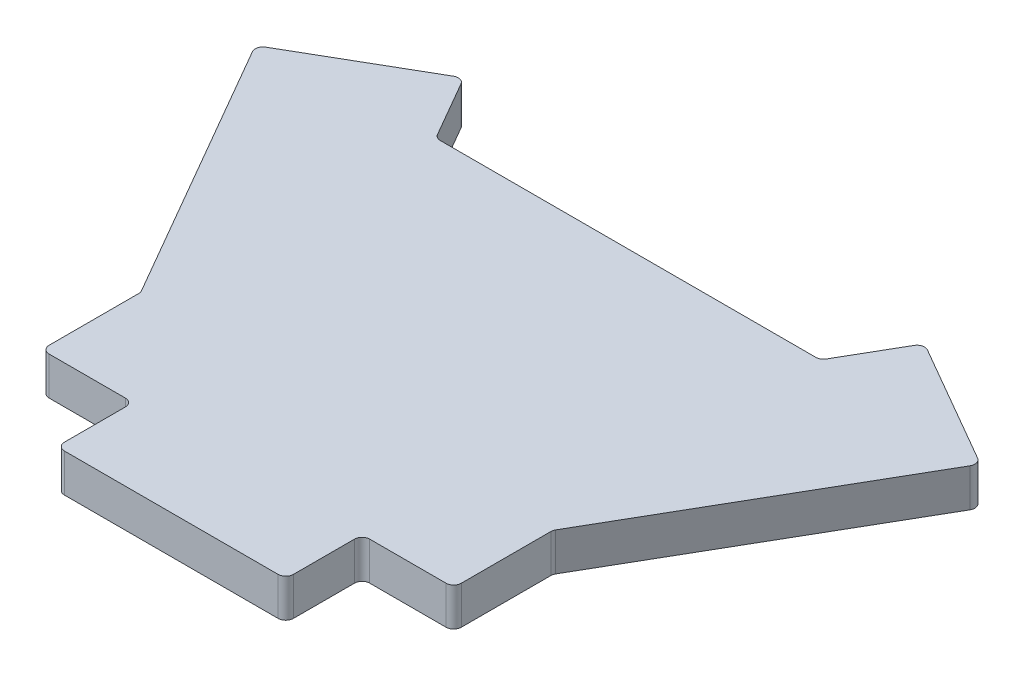
ISO-10303-21;
HEADER;
FILE_DESCRIPTION(('STEP AP214'),'2;1');
FILE_NAME('part.step','',(''),(''),'','','');
FILE_SCHEMA(('AUTOMOTIVE_DESIGN { 1 0 10303 214 1 1 1 1 }'));
ENDSEC;
DATA;
#1=APPLICATION_CONTEXT('core data for automotive mechanical design processes');
#2=APPLICATION_PROTOCOL_DEFINITION('international standard','automotive_design',2000,#1);
#3=PRODUCT_CONTEXT('',#1,'mechanical');
#4=PRODUCT('Part','Part','',(#3));
#5=PRODUCT_RELATED_PRODUCT_CATEGORY('part','',(#4));
#6=PRODUCT_DEFINITION_FORMATION('','',#4);
#7=PRODUCT_DEFINITION_CONTEXT('part definition',#1,'design');
#8=PRODUCT_DEFINITION('design','',#6,#7);
#9=PRODUCT_DEFINITION_SHAPE('','',#8);
#10=(LENGTH_UNIT() NAMED_UNIT(*) SI_UNIT(.MILLI.,.METRE.));
#11=(NAMED_UNIT(*) PLANE_ANGLE_UNIT() SI_UNIT($,.RADIAN.));
#12=(NAMED_UNIT(*) SI_UNIT($,.STERADIAN.) SOLID_ANGLE_UNIT());
#13=UNCERTAINTY_MEASURE_WITH_UNIT(LENGTH_MEASURE(1.E-05),#10,'distance_accuracy_value','');
#14=(GEOMETRIC_REPRESENTATION_CONTEXT(3) GLOBAL_UNCERTAINTY_ASSIGNED_CONTEXT((#13)) GLOBAL_UNIT_ASSIGNED_CONTEXT((#10,
#11,#12)) REPRESENTATION_CONTEXT('',''));
#15=CARTESIAN_POINT('',(0.,0.,0.));
#16=DIRECTION('',(0.,0.,1.));
#17=DIRECTION('',(1.,0.,0.));
#18=AXIS2_PLACEMENT_3D('',#15,#16,#17);
#19=CARTESIAN_POINT('',(-15.,5.,-10.));
#20=DIRECTION('',(0.,0.,-1.));
#21=DIRECTION('',(-1.,0.,0.));
#22=AXIS2_PLACEMENT_3D('',#19,#20,#21);
#23=PLANE('',#22);
#24=DIRECTION('',(1.,0.,0.));
#25=VECTOR('',#24,1.);
#26=CARTESIAN_POINT('',(-15.,5.,-10.));
#27=LINE('',#26,#25);
#28=CARTESIAN_POINT('',(-26.,5.,-9.99999999999999));
#29=VERTEX_POINT('',#28);
#30=CARTESIAN_POINT('',(-16.,5.,-10.));
#31=VERTEX_POINT('',#30);
#32=EDGE_CURVE('E272',#29,#31,#27,.T.);
#33=ORIENTED_EDGE('',*,*,#32,.F.);
#34=DIRECTION('',(0.,-1.,0.));
#35=VECTOR('',#34,1.);
#36=CARTESIAN_POINT('',(-26.,5.,-9.99999999999999));
#37=LINE('',#36,#35);
#38=CARTESIAN_POINT('',(-26.,0.,-9.99999999999999));
#39=VERTEX_POINT('',#38);
#40=EDGE_CURVE('E347',#29,#39,#37,.T.);
#41=ORIENTED_EDGE('',*,*,#40,.T.);
#42=DIRECTION('',(1.,0.,0.));
#43=VECTOR('',#42,1.);
#44=CARTESIAN_POINT('',(-15.,0.,-10.));
#45=LINE('',#44,#43);
#46=CARTESIAN_POINT('',(-16.,0.,-10.));
#47=VERTEX_POINT('',#46);
#48=EDGE_CURVE('E437',#39,#47,#45,.T.);
#49=ORIENTED_EDGE('',*,*,#48,.T.);
#50=DIRECTION('',(0.,-1.,0.));
#51=VECTOR('',#50,1.);
#52=CARTESIAN_POINT('',(-16.,5.,-10.));
#53=LINE('',#52,#51);
#54=EDGE_CURVE('E345',#47,#31,#53,.F.);
#55=ORIENTED_EDGE('',*,*,#54,.T.);
#56=EDGE_LOOP('',(#33,#41,#49,#55));
#57=FACE_BOUND('',#56,.T.);
#58=ADVANCED_FACE('F37',(#57),#23,.F.);
#59=CARTESIAN_POINT('',(-15.,5.,0.));
#60=DIRECTION('',(1.,0.,0.));
#61=DIRECTION('',(0.,0.,-1.));
#62=AXIS2_PLACEMENT_3D('',#59,#60,#61);
#63=PLANE('',#62);
#64=DIRECTION('',(0.,0.,1.));
#65=VECTOR('',#64,1.);
#66=CARTESIAN_POINT('',(-15.,0.,0.));
#67=LINE('',#66,#65);
#68=CARTESIAN_POINT('',(-15.,0.,-9.));
#69=VERTEX_POINT('',#68);
#70=CARTESIAN_POINT('',(-15.,0.,-1.));
#71=VERTEX_POINT('',#70);
#72=EDGE_CURVE('E440',#69,#71,#67,.T.);
#73=ORIENTED_EDGE('',*,*,#72,.T.);
#74=DIRECTION('',(0.,-1.,0.));
#75=VECTOR('',#74,1.);
#76=CARTESIAN_POINT('',(-15.,5.,-1.));
#77=LINE('',#76,#75);
#78=CARTESIAN_POINT('',(-15.,5.,-1.));
#79=VERTEX_POINT('',#78);
#80=EDGE_CURVE('E343',#71,#79,#77,.F.);
#81=ORIENTED_EDGE('',*,*,#80,.T.);
#82=DIRECTION('',(0.,0.,1.));
#83=VECTOR('',#82,1.);
#84=CARTESIAN_POINT('',(-15.,5.,0.));
#85=LINE('',#84,#83);
#86=CARTESIAN_POINT('',(-15.,5.,-9.));
#87=VERTEX_POINT('',#86);
#88=EDGE_CURVE('E539',#87,#79,#85,.T.);
#89=ORIENTED_EDGE('',*,*,#88,.F.);
#90=DIRECTION('',(0.,-1.,0.));
#91=VECTOR('',#90,1.);
#92=CARTESIAN_POINT('',(-15.,0.,-9.));
#93=LINE('',#92,#91);
#94=EDGE_CURVE('E340',#87,#69,#93,.T.);
#95=ORIENTED_EDGE('',*,*,#94,.T.);
#96=EDGE_LOOP('',(#73,#81,#89,#95));
#97=FACE_BOUND('',#96,.T.);
#98=ADVANCED_FACE('F469',(#97),#63,.F.);
#99=CARTESIAN_POINT('',(15.,5.,0.));
#100=DIRECTION('',(0.,0.,-1.));
#101=DIRECTION('',(-1.,0.,0.));
#102=AXIS2_PLACEMENT_3D('',#99,#100,#101);
#103=PLANE('',#102);
#104=DIRECTION('',(1.,0.,0.));
#105=VECTOR('',#104,1.);
#106=CARTESIAN_POINT('',(15.,5.,0.));
#107=LINE('',#106,#105);
#108=CARTESIAN_POINT('',(-14.,5.,0.));
#109=VERTEX_POINT('',#108);
#110=CARTESIAN_POINT('',(14.,5.,0.));
#111=VERTEX_POINT('',#110);
#112=EDGE_CURVE('E416',#109,#111,#107,.T.);
#113=ORIENTED_EDGE('',*,*,#112,.F.);
#114=DIRECTION('',(0.,-1.,0.));
#115=VECTOR('',#114,1.);
#116=CARTESIAN_POINT('',(-14.,5.,0.));
#117=LINE('',#116,#115);
#118=CARTESIAN_POINT('',(-14.,0.,0.));
#119=VERTEX_POINT('',#118);
#120=EDGE_CURVE('E337',#109,#119,#117,.T.);
#121=ORIENTED_EDGE('',*,*,#120,.T.);
#122=DIRECTION('',(1.,0.,0.));
#123=VECTOR('',#122,1.);
#124=CARTESIAN_POINT('',(15.,0.,0.));
#125=LINE('',#124,#123);
#126=CARTESIAN_POINT('',(14.,0.,0.));
#127=VERTEX_POINT('',#126);
#128=EDGE_CURVE('E397',#119,#127,#125,.T.);
#129=ORIENTED_EDGE('',*,*,#128,.T.);
#130=DIRECTION('',(0.,-1.,0.));
#131=VECTOR('',#130,1.);
#132=CARTESIAN_POINT('',(14.,5.,0.));
#133=LINE('',#132,#131);
#134=EDGE_CURVE('E335',#127,#111,#133,.F.);
#135=ORIENTED_EDGE('',*,*,#134,.T.);
#136=EDGE_LOOP('',(#113,#121,#129,#135));
#137=FACE_BOUND('',#136,.T.);
#138=ADVANCED_FACE('F475',(#137),#103,.F.);
#139=CARTESIAN_POINT('',(15.,5.,0.));
#140=DIRECTION('',(-1.,0.,0.));
#141=DIRECTION('',(0.,0.,1.));
#142=AXIS2_PLACEMENT_3D('',#139,#140,#141);
#143=PLANE('',#142);
#144=DIRECTION('',(0.,0.,-1.));
#145=VECTOR('',#144,1.);
#146=CARTESIAN_POINT('',(15.,0.,0.));
#147=LINE('',#146,#145);
#148=CARTESIAN_POINT('',(15.,0.,-1.));
#149=VERTEX_POINT('',#148);
#150=CARTESIAN_POINT('',(15.,0.,-9.));
#151=VERTEX_POINT('',#150);
#152=EDGE_CURVE('E386',#149,#151,#147,.T.);
#153=ORIENTED_EDGE('',*,*,#152,.T.);
#154=DIRECTION('',(0.,-1.,0.));
#155=VECTOR('',#154,1.);
#156=CARTESIAN_POINT('',(15.,5.,-9.));
#157=LINE('',#156,#155);
#158=CARTESIAN_POINT('',(15.,5.,-9.));
#159=VERTEX_POINT('',#158);
#160=EDGE_CURVE('E363',#151,#159,#157,.F.);
#161=ORIENTED_EDGE('',*,*,#160,.T.);
#162=DIRECTION('',(0.,0.,-1.));
#163=VECTOR('',#162,1.);
#164=CARTESIAN_POINT('',(15.,5.,0.));
#165=LINE('',#164,#163);
#166=CARTESIAN_POINT('',(15.,5.,-1.));
#167=VERTEX_POINT('',#166);
#168=EDGE_CURVE('E407',#167,#159,#165,.T.);
#169=ORIENTED_EDGE('',*,*,#168,.F.);
#170=DIRECTION('',(0.,-1.,0.));
#171=VECTOR('',#170,1.);
#172=CARTESIAN_POINT('',(15.,5.,-1.));
#173=LINE('',#172,#171);
#174=EDGE_CURVE('E360',#167,#149,#173,.T.);
#175=ORIENTED_EDGE('',*,*,#174,.T.);
#176=EDGE_LOOP('',(#153,#161,#169,#175));
#177=FACE_BOUND('',#176,.T.);
#178=ADVANCED_FACE('F393',(#177),#143,.F.);
#179=CARTESIAN_POINT('',(15.,5.,-10.));
#180=DIRECTION('',(0.,0.,-1.));
#181=DIRECTION('',(-1.,0.,0.));
#182=AXIS2_PLACEMENT_3D('',#179,#180,#181);
#183=PLANE('',#182);
#184=DIRECTION('',(1.,0.,0.));
#185=VECTOR('',#184,1.);
#186=CARTESIAN_POINT('',(15.,0.,-10.));
#187=LINE('',#186,#185);
#188=CARTESIAN_POINT('',(16.,0.,-10.));
#189=VERTEX_POINT('',#188);
#190=CARTESIAN_POINT('',(26.,0.,-9.99999999999999));
#191=VERTEX_POINT('',#190);
#192=EDGE_CURVE('E388',#189,#191,#187,.T.);
#193=ORIENTED_EDGE('',*,*,#192,.T.);
#194=DIRECTION('',(0.,-1.,0.));
#195=VECTOR('',#194,1.);
#196=CARTESIAN_POINT('',(26.,5.,-9.99999999999999));
#197=LINE('',#196,#195);
#198=CARTESIAN_POINT('',(26.,5.,-9.99999999999999));
#199=VERTEX_POINT('',#198);
#200=EDGE_CURVE('E358',#191,#199,#197,.F.);
#201=ORIENTED_EDGE('',*,*,#200,.T.);
#202=DIRECTION('',(1.,0.,0.));
#203=VECTOR('',#202,1.);
#204=CARTESIAN_POINT('',(15.,5.,-10.));
#205=LINE('',#204,#203);
#206=CARTESIAN_POINT('',(16.,5.,-10.));
#207=VERTEX_POINT('',#206);
#208=EDGE_CURVE('E405',#207,#199,#205,.T.);
#209=ORIENTED_EDGE('',*,*,#208,.F.);
#210=DIRECTION('',(0.,-1.,0.));
#211=VECTOR('',#210,1.);
#212=CARTESIAN_POINT('',(16.,0.,-10.));
#213=LINE('',#212,#211);
#214=EDGE_CURVE('E355',#207,#189,#213,.T.);
#215=ORIENTED_EDGE('',*,*,#214,.T.);
#216=EDGE_LOOP('',(#193,#201,#209,#215));
#217=FACE_BOUND('',#216,.T.);
#218=ADVANCED_FACE('F409',(#217),#183,.F.);
#219=CARTESIAN_POINT('',(27.,5.,-9.99999999999999));
#220=DIRECTION('',(-1.,0.,0.));
#221=DIRECTION('',(0.,0.,1.));
#222=AXIS2_PLACEMENT_3D('',#219,#220,#221);
#223=PLANE('',#222);
#224=DIRECTION('',(0.,0.,-1.));
#225=VECTOR('',#224,1.);
#226=CARTESIAN_POINT('',(27.,0.,-9.99999999999999));
#227=LINE('',#226,#225);
#228=CARTESIAN_POINT('',(27.,0.,-11.));
#229=VERTEX_POINT('',#228);
#230=CARTESIAN_POINT('',(27.,0.,-22.7320508075689));
#231=VERTEX_POINT('',#230);
#232=EDGE_CURVE('E255',#229,#231,#227,.T.);
#233=ORIENTED_EDGE('',*,*,#232,.T.);
#234=DIRECTION('',(0.,-1.,0.));
#235=VECTOR('',#234,1.);
#236=CARTESIAN_POINT('',(27.,5.,-22.7320508075689));
#237=LINE('',#236,#235);
#238=CARTESIAN_POINT('',(27.,5.,-22.7320508075689));
#239=VERTEX_POINT('',#238);
#240=EDGE_CURVE('E353',#231,#239,#237,.F.);
#241=ORIENTED_EDGE('',*,*,#240,.T.);
#242=DIRECTION('',(0.,0.,-1.));
#243=VECTOR('',#242,1.);
#244=CARTESIAN_POINT('',(27.,5.,-9.99999999999999));
#245=LINE('',#244,#243);
#246=CARTESIAN_POINT('',(27.,5.,-11.));
#247=VERTEX_POINT('',#246);
#248=EDGE_CURVE('E411',#247,#239,#245,.T.);
#249=ORIENTED_EDGE('',*,*,#248,.F.);
#250=DIRECTION('',(0.,-1.,0.));
#251=VECTOR('',#250,1.);
#252=CARTESIAN_POINT('',(27.,5.,-11.));
#253=LINE('',#252,#251);
#254=EDGE_CURVE('E350',#247,#229,#253,.T.);
#255=ORIENTED_EDGE('',*,*,#254,.T.);
#256=EDGE_LOOP('',(#233,#241,#249,#255));
#257=FACE_BOUND('',#256,.T.);
#258=ADVANCED_FACE('F449',(#257),#223,.F.);
#259=CARTESIAN_POINT('',(27.,5.,-23.));
#260=DIRECTION('',(-0.866025403784438,0.,-0.500000000000001));
#261=DIRECTION('',(-0.500000000000001,0.,0.866025403784438));
#262=AXIS2_PLACEMENT_3D('',#259,#260,#261);
#263=PLANE('',#262);
#264=DIRECTION('',(0.500000000000001,0.,-0.866025403784438));
#265=VECTOR('',#264,1.);
#266=CARTESIAN_POINT('',(27.,0.,-23.));
#267=LINE('',#266,#265);
#268=CARTESIAN_POINT('',(27.1339745962156,0.,-23.2320508075689));
#269=VERTEX_POINT('',#268);
#270=CARTESIAN_POINT('',(47.,0.,-57.6410161513774));
#271=VERTEX_POINT('',#270);
#272=EDGE_CURVE('E250',#269,#271,#267,.T.);
#273=ORIENTED_EDGE('',*,*,#272,.T.);
#274=DIRECTION('',(0.,-1.,0.));
#275=VECTOR('',#274,1.);
#276=CARTESIAN_POINT('',(47.,5.,-57.6410161513774));
#277=LINE('',#276,#275);
#278=CARTESIAN_POINT('',(47.,5.,-57.6410161513774));
#279=VERTEX_POINT('',#278);
#280=EDGE_CURVE('E228',#271,#279,#277,.F.);
#281=ORIENTED_EDGE('',*,*,#280,.T.);
#282=DIRECTION('',(0.500000000000001,0.,-0.866025403784438));
#283=VECTOR('',#282,1.);
#284=CARTESIAN_POINT('',(27.,5.,-23.));
#285=LINE('',#284,#283);
#286=CARTESIAN_POINT('',(27.1339745962156,5.,-23.2320508075689));
#287=VERTEX_POINT('',#286);
#288=EDGE_CURVE('E414',#287,#279,#285,.T.);
#289=ORIENTED_EDGE('',*,*,#288,.F.);
#290=DIRECTION('',(0.,-1.,0.));
#291=VECTOR('',#290,1.);
#292=CARTESIAN_POINT('',(27.1339745962156,0.,-23.2320508075689));
#293=LINE('',#292,#291);
#294=EDGE_CURVE('E233',#287,#269,#293,.T.);
#295=ORIENTED_EDGE('',*,*,#294,.T.);
#296=EDGE_LOOP('',(#273,#281,#289,#295));
#297=FACE_BOUND('',#296,.T.);
#298=ADVANCED_FACE('F458',(#297),#263,.F.);
#299=CARTESIAN_POINT('',(47.5,5.,-58.5070415551619));
#300=DIRECTION('',(-0.500000000000001,0.,0.866025403784438));
#301=DIRECTION('',(0.866025403784438,0.,0.500000000000001));
#302=AXIS2_PLACEMENT_3D('',#299,#300,#301);
#303=PLANE('',#302);
#304=DIRECTION('',(-0.866025403784438,0.,-0.500000000000001));
#305=VECTOR('',#304,1.);
#306=CARTESIAN_POINT('',(47.5,5.,-58.5070415551619));
#307=LINE('',#306,#305);
#308=CARTESIAN_POINT('',(46.6339745962156,5.,-59.0070415551619));
#309=VERTEX_POINT('',#308);
#310=CARTESIAN_POINT('',(31.0455173280957,5.,-68.0070415551619));
#311=VERTEX_POINT('',#310);
#312=EDGE_CURVE('E243',#309,#311,#307,.T.);
#313=ORIENTED_EDGE('',*,*,#312,.F.);
#314=DIRECTION('',(0.,-1.,0.));
#315=VECTOR('',#314,1.);
#316=CARTESIAN_POINT('',(46.6339745962156,5.,-59.0070415551619));
#317=LINE('',#316,#315);
#318=CARTESIAN_POINT('',(46.6339745962156,0.,-59.0070415551619));
#319=VERTEX_POINT('',#318);
#320=EDGE_CURVE('E227',#309,#319,#317,.T.);
#321=ORIENTED_EDGE('',*,*,#320,.T.);
#322=DIRECTION('',(-0.866025403784438,0.,-0.500000000000001));
#323=VECTOR('',#322,1.);
#324=CARTESIAN_POINT('',(47.5,0.,-58.5070415551619));
#325=LINE('',#324,#323);
#326=CARTESIAN_POINT('',(31.0455173280957,0.,-68.0070415551619));
#327=VERTEX_POINT('',#326);
#328=EDGE_CURVE('E240',#319,#327,#325,.T.);
#329=ORIENTED_EDGE('',*,*,#328,.T.);
#330=DIRECTION('',(0.,-1.,0.));
#331=VECTOR('',#330,1.);
#332=CARTESIAN_POINT('',(31.0455173280957,5.,-68.0070415551619));
#333=LINE('',#332,#331);
#334=EDGE_CURVE('E245',#327,#311,#333,.F.);
#335=ORIENTED_EDGE('',*,*,#334,.T.);
#336=EDGE_LOOP('',(#313,#321,#329,#335));
#337=FACE_BOUND('',#336,.T.);
#338=ADVANCED_FACE('F239',(#337),#303,.F.);
#339=CARTESIAN_POINT('',(30.1794919243112,5.,-68.5070415551619));
#340=DIRECTION('',(0.866025403784438,0.,0.5));
#341=DIRECTION('',(0.5,0.,-0.866025403784438));
#342=AXIS2_PLACEMENT_3D('',#339,#340,#341);
#343=PLANE('',#342);
#344=DIRECTION('',(-0.5,0.,0.866025403784438));
#345=VECTOR('',#344,1.);
#346=CARTESIAN_POINT('',(30.1794919243112,5.,-68.5070415551619));
#347=LINE('',#346,#345);
#348=CARTESIAN_POINT('',(29.6794919243112,5.,-67.6410161513775));
#349=VERTEX_POINT('',#348);
#350=CARTESIAN_POINT('',(25.4681670589061,5.,-60.3467875173175));
#351=VERTEX_POINT('',#350);
#352=EDGE_CURVE('E422',#349,#351,#347,.T.);
#353=ORIENTED_EDGE('',*,*,#352,.F.);
#354=DIRECTION('',(0.,-1.,0.));
#355=VECTOR('',#354,1.);
#356=CARTESIAN_POINT('',(29.6794919243112,5.,-67.6410161513775));
#357=LINE('',#356,#355);
#358=CARTESIAN_POINT('',(29.6794919243112,0.,-67.6410161513775));
#359=VERTEX_POINT('',#358);
#360=EDGE_CURVE('E308',#349,#359,#357,.T.);
#361=ORIENTED_EDGE('',*,*,#360,.T.);
#362=DIRECTION('',(-0.5,0.,0.866025403784438));
#363=VECTOR('',#362,1.);
#364=CARTESIAN_POINT('',(30.1794919243112,0.,-68.5070415551619));
#365=LINE('',#364,#363);
#366=CARTESIAN_POINT('',(25.4681670589061,0.,-60.3467875173175));
#367=VERTEX_POINT('',#366);
#368=EDGE_CURVE('E249',#359,#367,#365,.T.);
#369=ORIENTED_EDGE('',*,*,#368,.T.);
#370=DIRECTION('',(0.,-1.,0.));
#371=VECTOR('',#370,1.);
#372=CARTESIAN_POINT('',(25.4681670589061,5.,-60.3467875173175));
#373=LINE('',#372,#371);
#374=EDGE_CURVE('E306',#367,#351,#373,.F.);
#375=ORIENTED_EDGE('',*,*,#374,.T.);
#376=EDGE_LOOP('',(#353,#361,#369,#375));
#377=FACE_BOUND('',#376,.T.);
#378=ADVANCED_FACE('F465',(#377),#343,.F.);
#379=CARTESIAN_POINT('',(-25.1794919243112,5.,-59.8467875173175));
#380=DIRECTION('',(0.,0.,1.));
#381=DIRECTION('',(1.,0.,0.));
#382=AXIS2_PLACEMENT_3D('',#379,#380,#381);
#383=PLANE('',#382);
#384=DIRECTION('',(-1.,0.,0.));
#385=VECTOR('',#384,1.);
#386=CARTESIAN_POINT('',(-25.1794919243112,5.,-59.8467875173175));
#387=LINE('',#386,#385);
#388=CARTESIAN_POINT('',(24.6021416551216,5.,-59.8467875173175));
#389=VERTEX_POINT('',#388);
#390=CARTESIAN_POINT('',(-24.6021416551216,5.,-59.8467875173175));
#391=VERTEX_POINT('',#390);
#392=EDGE_CURVE('E425',#389,#391,#387,.T.);
#393=ORIENTED_EDGE('',*,*,#392,.F.);
#394=DIRECTION('',(0.,-1.,0.));
#395=VECTOR('',#394,1.);
#396=CARTESIAN_POINT('',(24.6021416551216,0.,-59.8467875173175));
#397=LINE('',#396,#395);
#398=CARTESIAN_POINT('',(24.6021416551216,0.,-59.8467875173175));
#399=VERTEX_POINT('',#398);
#400=EDGE_CURVE('E313',#389,#399,#397,.T.);
#401=ORIENTED_EDGE('',*,*,#400,.T.);
#402=DIRECTION('',(-1.,0.,0.));
#403=VECTOR('',#402,1.);
#404=CARTESIAN_POINT('',(-25.1794919243112,0.,-59.8467875173175));
#405=LINE('',#404,#403);
#406=CARTESIAN_POINT('',(-24.6021416551216,0.,-59.8467875173175));
#407=VERTEX_POINT('',#406);
#408=EDGE_CURVE('E253',#399,#407,#405,.T.);
#409=ORIENTED_EDGE('',*,*,#408,.T.);
#410=DIRECTION('',(0.,-1.,0.));
#411=VECTOR('',#410,1.);
#412=CARTESIAN_POINT('',(-24.6021416551216,5.,-59.8467875173175));
#413=LINE('',#412,#411);
#414=EDGE_CURVE('E311',#407,#391,#413,.F.);
#415=ORIENTED_EDGE('',*,*,#414,.T.);
#416=EDGE_LOOP('',(#393,#401,#409,#415));
#417=FACE_BOUND('',#416,.T.);
#418=ADVANCED_FACE('F587',(#417),#383,.F.);
#419=CARTESIAN_POINT('',(-30.1794919243112,5.,-68.5070415551619));
#420=DIRECTION('',(-0.866025403784438,0.,0.5));
#421=DIRECTION('',(0.5,0.,0.866025403784438));
#422=AXIS2_PLACEMENT_3D('',#419,#420,#421);
#423=PLANE('',#422);
#424=DIRECTION('',(-0.5,0.,-0.866025403784438));
#425=VECTOR('',#424,1.);
#426=CARTESIAN_POINT('',(-30.1794919243112,5.,-68.5070415551619));
#427=LINE('',#426,#425);
#428=CARTESIAN_POINT('',(-25.4681670589061,5.,-60.3467875173175));
#429=VERTEX_POINT('',#428);
#430=CARTESIAN_POINT('',(-29.6794919243112,5.,-67.6410161513775));
#431=VERTEX_POINT('',#430);
#432=EDGE_CURVE('E428',#429,#431,#427,.T.);
#433=ORIENTED_EDGE('',*,*,#432,.F.);
#434=DIRECTION('',(0.,-1.,0.));
#435=VECTOR('',#434,1.);
#436=CARTESIAN_POINT('',(-25.4681670589061,0.,-60.3467875173175));
#437=LINE('',#436,#435);
#438=CARTESIAN_POINT('',(-25.4681670589061,0.,-60.3467875173175));
#439=VERTEX_POINT('',#438);
#440=EDGE_CURVE('E318',#429,#439,#437,.T.);
#441=ORIENTED_EDGE('',*,*,#440,.T.);
#442=DIRECTION('',(-0.5,0.,-0.866025403784438));
#443=VECTOR('',#442,1.);
#444=CARTESIAN_POINT('',(-30.1794919243112,0.,-68.5070415551619));
#445=LINE('',#444,#443);
#446=CARTESIAN_POINT('',(-29.6794919243112,0.,-67.6410161513775));
#447=VERTEX_POINT('',#446);
#448=EDGE_CURVE('E261',#439,#447,#445,.T.);
#449=ORIENTED_EDGE('',*,*,#448,.T.);
#450=DIRECTION('',(0.,-1.,0.));
#451=VECTOR('',#450,1.);
#452=CARTESIAN_POINT('',(-29.6794919243112,5.,-67.6410161513775));
#453=LINE('',#452,#451);
#454=EDGE_CURVE('E316',#447,#431,#453,.F.);
#455=ORIENTED_EDGE('',*,*,#454,.T.);
#456=EDGE_LOOP('',(#433,#441,#449,#455));
#457=FACE_BOUND('',#456,.T.);
#458=ADVANCED_FACE('F597',(#457),#423,.F.);
#459=CARTESIAN_POINT('',(-47.5,5.,-58.5070415551619));
#460=DIRECTION('',(0.500000000000001,0.,0.866025403784438));
#461=DIRECTION('',(0.866025403784438,0.,-0.500000000000001));
#462=AXIS2_PLACEMENT_3D('',#459,#460,#461);
#463=PLANE('',#462);
#464=DIRECTION('',(-0.866025403784438,0.,0.500000000000001));
#465=VECTOR('',#464,1.);
#466=CARTESIAN_POINT('',(-47.5,5.,-58.5070415551619));
#467=LINE('',#466,#465);
#468=CARTESIAN_POINT('',(-31.0455173280957,5.,-68.0070415551619));
#469=VERTEX_POINT('',#468);
#470=CARTESIAN_POINT('',(-46.6339745962156,5.,-59.0070415551619));
#471=VERTEX_POINT('',#470);
#472=EDGE_CURVE('E431',#469,#471,#467,.T.);
#473=ORIENTED_EDGE('',*,*,#472,.F.);
#474=DIRECTION('',(0.,-1.,0.));
#475=VECTOR('',#474,1.);
#476=CARTESIAN_POINT('',(-31.0455173280957,5.,-68.0070415551619));
#477=LINE('',#476,#475);
#478=CARTESIAN_POINT('',(-31.0455173280957,0.,-68.0070415551619));
#479=VERTEX_POINT('',#478);
#480=EDGE_CURVE('E323',#469,#479,#477,.T.);
#481=ORIENTED_EDGE('',*,*,#480,.T.);
#482=DIRECTION('',(-0.866025403784438,0.,0.500000000000001));
#483=VECTOR('',#482,1.);
#484=CARTESIAN_POINT('',(-47.5,0.,-58.5070415551619));
#485=LINE('',#484,#483);
#486=CARTESIAN_POINT('',(-46.6339745962156,0.,-59.0070415551619));
#487=VERTEX_POINT('',#486);
#488=EDGE_CURVE('E264',#479,#487,#485,.T.);
#489=ORIENTED_EDGE('',*,*,#488,.T.);
#490=DIRECTION('',(0.,-1.,0.));
#491=VECTOR('',#490,1.);
#492=CARTESIAN_POINT('',(-46.6339745962156,5.,-59.0070415551619));
#493=LINE('',#492,#491);
#494=EDGE_CURVE('E321',#487,#471,#493,.F.);
#495=ORIENTED_EDGE('',*,*,#494,.T.);
#496=EDGE_LOOP('',(#473,#481,#489,#495));
#497=FACE_BOUND('',#496,.T.);
#498=ADVANCED_FACE('F607',(#497),#463,.F.);
#499=CARTESIAN_POINT('',(-27.,5.,-23.));
#500=DIRECTION('',(0.866025403784438,0.,-0.500000000000001));
#501=DIRECTION('',(-0.500000000000001,0.,-0.866025403784438));
#502=AXIS2_PLACEMENT_3D('',#499,#500,#501);
#503=PLANE('',#502);
#504=DIRECTION('',(0.500000000000001,0.,0.866025403784438));
#505=VECTOR('',#504,1.);
#506=CARTESIAN_POINT('',(-27.,5.,-23.));
#507=LINE('',#506,#505);
#508=CARTESIAN_POINT('',(-47.,5.,-57.6410161513774));
#509=VERTEX_POINT('',#508);
#510=CARTESIAN_POINT('',(-27.1339745962156,5.,-23.2320508075689));
#511=VERTEX_POINT('',#510);
#512=EDGE_CURVE('E434',#509,#511,#507,.T.);
#513=ORIENTED_EDGE('',*,*,#512,.F.);
#514=DIRECTION('',(0.,-1.,0.));
#515=VECTOR('',#514,1.);
#516=CARTESIAN_POINT('',(-47.,5.,-57.6410161513774));
#517=LINE('',#516,#515);
#518=CARTESIAN_POINT('',(-47.,0.,-57.6410161513774));
#519=VERTEX_POINT('',#518);
#520=EDGE_CURVE('E328',#509,#519,#517,.T.);
#521=ORIENTED_EDGE('',*,*,#520,.T.);
#522=DIRECTION('',(0.500000000000001,0.,0.866025403784438));
#523=VECTOR('',#522,1.);
#524=CARTESIAN_POINT('',(-27.,0.,-23.));
#525=LINE('',#524,#523);
#526=CARTESIAN_POINT('',(-27.1339745962156,0.,-23.2320508075689));
#527=VERTEX_POINT('',#526);
#528=EDGE_CURVE('E267',#519,#527,#525,.T.);
#529=ORIENTED_EDGE('',*,*,#528,.T.);
#530=DIRECTION('',(0.,-1.,0.));
#531=VECTOR('',#530,1.);
#532=CARTESIAN_POINT('',(-27.1339745962156,5.,-23.2320508075689));
#533=LINE('',#532,#531);
#534=EDGE_CURVE('E326',#527,#511,#533,.F.);
#535=ORIENTED_EDGE('',*,*,#534,.T.);
#536=EDGE_LOOP('',(#513,#521,#529,#535));
#537=FACE_BOUND('',#536,.T.);
#538=ADVANCED_FACE('F617',(#537),#503,.F.);
#539=CARTESIAN_POINT('',(-27.,5.,-9.99999999999999));
#540=DIRECTION('',(1.,0.,0.));
#541=DIRECTION('',(0.,0.,-1.));
#542=AXIS2_PLACEMENT_3D('',#539,#540,#541);
#543=PLANE('',#542);
#544=DIRECTION('',(0.,0.,1.));
#545=VECTOR('',#544,1.);
#546=CARTESIAN_POINT('',(-27.,5.,-9.99999999999999));
#547=LINE('',#546,#545);
#548=CARTESIAN_POINT('',(-27.,5.,-22.7320508075689));
#549=VERTEX_POINT('',#548);
#550=CARTESIAN_POINT('',(-27.,5.,-11.));
#551=VERTEX_POINT('',#550);
#552=EDGE_CURVE('E273',#549,#551,#547,.T.);
#553=ORIENTED_EDGE('',*,*,#552,.F.);
#554=DIRECTION('',(0.,-1.,0.));
#555=VECTOR('',#554,1.);
#556=CARTESIAN_POINT('',(-27.,0.,-22.7320508075689));
#557=LINE('',#556,#555);
#558=CARTESIAN_POINT('',(-27.,0.,-22.7320508075689));
#559=VERTEX_POINT('',#558);
#560=EDGE_CURVE('E332',#549,#559,#557,.T.);
#561=ORIENTED_EDGE('',*,*,#560,.T.);
#562=DIRECTION('',(0.,0.,1.));
#563=VECTOR('',#562,1.);
#564=CARTESIAN_POINT('',(-27.,0.,-9.99999999999999));
#565=LINE('',#564,#563);
#566=CARTESIAN_POINT('',(-27.,0.,-11.));
#567=VERTEX_POINT('',#566);
#568=EDGE_CURVE('E270',#559,#567,#565,.T.);
#569=ORIENTED_EDGE('',*,*,#568,.T.);
#570=DIRECTION('',(0.,-1.,0.));
#571=VECTOR('',#570,1.);
#572=CARTESIAN_POINT('',(-27.,5.,-11.));
#573=LINE('',#572,#571);
#574=EDGE_CURVE('E52',#567,#551,#573,.F.);
#575=ORIENTED_EDGE('',*,*,#574,.T.);
#576=EDGE_LOOP('',(#553,#561,#569,#575));
#577=FACE_BOUND('',#576,.T.);
#578=ADVANCED_FACE('F627',(#577),#543,.F.);
#579=CARTESIAN_POINT('',(0.,5.,0.));
#580=DIRECTION('',(0.,-1.,0.));
#581=DIRECTION('',(0.,0.,-1.));
#582=AXIS2_PLACEMENT_3D('',#579,#580,#581);
#583=PLANE('',#582);
#584=ORIENTED_EDGE('',*,*,#288,.T.);
#585=CARTESIAN_POINT('',(46.1339745962156,5.,-58.1410161513774));
#586=DIRECTION('',(0.,-1.,0.));
#587=DIRECTION('',(0.,0.,-1.));
#588=AXIS2_PLACEMENT_3D('',#585,#586,#587);
#589=CIRCLE('',#588,1.);
#590=EDGE_CURVE('E304',#279,#309,#589,.F.);
#591=ORIENTED_EDGE('',*,*,#590,.T.);
#592=ORIENTED_EDGE('',*,*,#312,.T.);
#593=CARTESIAN_POINT('',(30.5455173280957,5.,-67.1410161513775));
#594=DIRECTION('',(0.,-1.,0.));
#595=DIRECTION('',(0.,0.,-1.));
#596=AXIS2_PLACEMENT_3D('',#593,#594,#595);
#597=CIRCLE('',#596,1.);
#598=EDGE_CURVE('E302',#311,#349,#597,.F.);
#599=ORIENTED_EDGE('',*,*,#598,.T.);
#600=ORIENTED_EDGE('',*,*,#352,.T.);
#601=CARTESIAN_POINT('',(24.6021416551216,5.,-60.8467875173175));
#602=DIRECTION('',(0.,-1.,0.));
#603=DIRECTION('',(0.,0.,-1.));
#604=AXIS2_PLACEMENT_3D('',#601,#602,#603);
#605=CIRCLE('',#604,1.);
#606=EDGE_CURVE('E367',#351,#389,#605,.T.);
#607=ORIENTED_EDGE('',*,*,#606,.T.);
#608=ORIENTED_EDGE('',*,*,#392,.T.);
#609=CARTESIAN_POINT('',(-24.6021416551216,5.,-60.8467875173175));
#610=DIRECTION('',(0.,-1.,0.));
#611=DIRECTION('',(0.,0.,-1.));
#612=AXIS2_PLACEMENT_3D('',#609,#610,#611);
#613=CIRCLE('',#612,1.);
#614=EDGE_CURVE('E371',#391,#429,#613,.T.);
#615=ORIENTED_EDGE('',*,*,#614,.T.);
#616=ORIENTED_EDGE('',*,*,#432,.T.);
#617=CARTESIAN_POINT('',(-30.5455173280957,5.,-67.1410161513775));
#618=DIRECTION('',(0.,-1.,0.));
#619=DIRECTION('',(0.,0.,-1.));
#620=AXIS2_PLACEMENT_3D('',#617,#618,#619);
#621=CIRCLE('',#620,1.);
#622=EDGE_CURVE('E300',#431,#469,#621,.F.);
#623=ORIENTED_EDGE('',*,*,#622,.T.);
#624=ORIENTED_EDGE('',*,*,#472,.T.);
#625=CARTESIAN_POINT('',(-46.1339745962156,5.,-58.1410161513774));
#626=DIRECTION('',(0.,-1.,0.));
#627=DIRECTION('',(0.,0.,-1.));
#628=AXIS2_PLACEMENT_3D('',#625,#626,#627);
#629=CIRCLE('',#628,1.);
#630=EDGE_CURVE('E298',#471,#509,#629,.F.);
#631=ORIENTED_EDGE('',*,*,#630,.T.);
#632=ORIENTED_EDGE('',*,*,#512,.T.);
#633=CARTESIAN_POINT('',(-28.,5.,-22.7320508075689));
#634=DIRECTION('',(0.,-1.,0.));
#635=DIRECTION('',(0.,0.,-1.));
#636=AXIS2_PLACEMENT_3D('',#633,#634,#635);
#637=CIRCLE('',#636,1.);
#638=EDGE_CURVE('E59',#511,#549,#637,.T.);
#639=ORIENTED_EDGE('',*,*,#638,.T.);
#640=ORIENTED_EDGE('',*,*,#552,.T.);
#641=CARTESIAN_POINT('',(-26.,5.,-11.));
#642=DIRECTION('',(0.,-1.,0.));
#643=DIRECTION('',(0.,0.,-1.));
#644=AXIS2_PLACEMENT_3D('',#641,#642,#643);
#645=CIRCLE('',#644,1.);
#646=EDGE_CURVE('E294',#551,#29,#645,.F.);
#647=ORIENTED_EDGE('',*,*,#646,.T.);
#648=ORIENTED_EDGE('',*,*,#32,.T.);
#649=CARTESIAN_POINT('',(-16.,5.,-9.));
#650=DIRECTION('',(0.,-1.,0.));
#651=DIRECTION('',(0.,0.,-1.));
#652=AXIS2_PLACEMENT_3D('',#649,#650,#651);
#653=CIRCLE('',#652,1.);
#654=EDGE_CURVE('E378',#31,#87,#653,.T.);
#655=ORIENTED_EDGE('',*,*,#654,.T.);
#656=ORIENTED_EDGE('',*,*,#88,.T.);
#657=CARTESIAN_POINT('',(-14.,5.,-1.));
#658=DIRECTION('',(0.,-1.,0.));
#659=DIRECTION('',(0.,0.,-1.));
#660=AXIS2_PLACEMENT_3D('',#657,#658,#659);
#661=CIRCLE('',#660,1.);
#662=EDGE_CURVE('E296',#79,#109,#661,.F.);
#663=ORIENTED_EDGE('',*,*,#662,.T.);
#664=ORIENTED_EDGE('',*,*,#112,.T.);
#665=CARTESIAN_POINT('',(14.,5.,-1.));
#666=DIRECTION('',(0.,-1.,0.));
#667=DIRECTION('',(0.,0.,-1.));
#668=AXIS2_PLACEMENT_3D('',#665,#666,#667);
#669=CIRCLE('',#668,1.);
#670=EDGE_CURVE('E290',#111,#167,#669,.F.);
#671=ORIENTED_EDGE('',*,*,#670,.T.);
#672=ORIENTED_EDGE('',*,*,#168,.T.);
#673=CARTESIAN_POINT('',(16.,5.,-9.));
#674=DIRECTION('',(0.,-1.,0.));
#675=DIRECTION('',(0.,0.,-1.));
#676=AXIS2_PLACEMENT_3D('',#673,#674,#675);
#677=CIRCLE('',#676,1.);
#678=EDGE_CURVE('E11',#159,#207,#677,.T.);
#679=ORIENTED_EDGE('',*,*,#678,.T.);
#680=ORIENTED_EDGE('',*,*,#208,.T.);
#681=CARTESIAN_POINT('',(26.,5.,-11.));
#682=DIRECTION('',(0.,-1.,0.));
#683=DIRECTION('',(0.,0.,-1.));
#684=AXIS2_PLACEMENT_3D('',#681,#682,#683);
#685=CIRCLE('',#684,1.);
#686=EDGE_CURVE('E292',#199,#247,#685,.F.);
#687=ORIENTED_EDGE('',*,*,#686,.T.);
#688=ORIENTED_EDGE('',*,*,#248,.T.);
#689=CARTESIAN_POINT('',(28.,5.,-22.7320508075689));
#690=DIRECTION('',(0.,-1.,0.));
#691=DIRECTION('',(0.,0.,-1.));
#692=AXIS2_PLACEMENT_3D('',#689,#690,#691);
#693=CIRCLE('',#692,1.);
#694=EDGE_CURVE('E382',#239,#287,#693,.T.);
#695=ORIENTED_EDGE('',*,*,#694,.T.);
#696=EDGE_LOOP('',(#584,#591,#592,#599,#600,#607,#608,#615,#616,#623,#624,#631,#632,#639,#640,
#647,#648,#655,#656,#663,#664,#671,#672,#679,#680,#687,#688,#695));
#697=FACE_BOUND('',#696,.T.);
#698=ADVANCED_FACE('F404',(#697),#583,.F.);
#699=CARTESIAN_POINT('',(0.,0.,0.));
#700=DIRECTION('',(0.,-1.,0.));
#701=DIRECTION('',(0.,0.,-1.));
#702=AXIS2_PLACEMENT_3D('',#699,#700,#701);
#703=PLANE('',#702);
#704=ORIENTED_EDGE('',*,*,#328,.F.);
#705=CARTESIAN_POINT('',(46.1339745962156,0.,-58.1410161513774));
#706=DIRECTION('',(0.,-1.,0.));
#707=DIRECTION('',(0.,0.,-1.));
#708=AXIS2_PLACEMENT_3D('',#705,#706,#707);
#709=CIRCLE('',#708,1.);
#710=EDGE_CURVE('E223',#319,#271,#709,.T.);
#711=ORIENTED_EDGE('',*,*,#710,.T.);
#712=ORIENTED_EDGE('',*,*,#272,.F.);
#713=CARTESIAN_POINT('',(28.,0.,-22.7320508075689));
#714=DIRECTION('',(0.,-1.,0.));
#715=DIRECTION('',(0.,0.,-1.));
#716=AXIS2_PLACEMENT_3D('',#713,#714,#715);
#717=CIRCLE('',#716,1.);
#718=EDGE_CURVE('E380',#269,#231,#717,.F.);
#719=ORIENTED_EDGE('',*,*,#718,.T.);
#720=ORIENTED_EDGE('',*,*,#232,.F.);
#721=CARTESIAN_POINT('',(26.,0.,-11.));
#722=DIRECTION('',(0.,-1.,0.));
#723=DIRECTION('',(0.,0.,-1.));
#724=AXIS2_PLACEMENT_3D('',#721,#722,#723);
#725=CIRCLE('',#724,1.);
#726=EDGE_CURVE('E276',#229,#191,#725,.T.);
#727=ORIENTED_EDGE('',*,*,#726,.T.);
#728=ORIENTED_EDGE('',*,*,#192,.F.);
#729=CARTESIAN_POINT('',(16.,0.,-9.));
#730=DIRECTION('',(0.,-1.,0.));
#731=DIRECTION('',(0.,0.,-1.));
#732=AXIS2_PLACEMENT_3D('',#729,#730,#731);
#733=CIRCLE('',#732,1.);
#734=EDGE_CURVE('E45',#189,#151,#733,.F.);
#735=ORIENTED_EDGE('',*,*,#734,.T.);
#736=ORIENTED_EDGE('',*,*,#152,.F.);
#737=CARTESIAN_POINT('',(14.,0.,-1.));
#738=DIRECTION('',(0.,-1.,0.));
#739=DIRECTION('',(0.,0.,-1.));
#740=AXIS2_PLACEMENT_3D('',#737,#738,#739);
#741=CIRCLE('',#740,1.);
#742=EDGE_CURVE('E244',#149,#127,#741,.T.);
#743=ORIENTED_EDGE('',*,*,#742,.T.);
#744=ORIENTED_EDGE('',*,*,#128,.F.);
#745=CARTESIAN_POINT('',(-14.,0.,-1.));
#746=DIRECTION('',(0.,-1.,0.));
#747=DIRECTION('',(0.,0.,-1.));
#748=AXIS2_PLACEMENT_3D('',#745,#746,#747);
#749=CIRCLE('',#748,1.);
#750=EDGE_CURVE('E280',#119,#71,#749,.T.);
#751=ORIENTED_EDGE('',*,*,#750,.T.);
#752=ORIENTED_EDGE('',*,*,#72,.F.);
#753=CARTESIAN_POINT('',(-16.,0.,-9.));
#754=DIRECTION('',(0.,-1.,0.));
#755=DIRECTION('',(0.,0.,-1.));
#756=AXIS2_PLACEMENT_3D('',#753,#754,#755);
#757=CIRCLE('',#756,1.);
#758=EDGE_CURVE('E376',#69,#47,#757,.F.);
#759=ORIENTED_EDGE('',*,*,#758,.T.);
#760=ORIENTED_EDGE('',*,*,#48,.F.);
#761=CARTESIAN_POINT('',(-26.,0.,-11.));
#762=DIRECTION('',(0.,-1.,0.));
#763=DIRECTION('',(0.,0.,-1.));
#764=AXIS2_PLACEMENT_3D('',#761,#762,#763);
#765=CIRCLE('',#764,1.);
#766=EDGE_CURVE('E278',#39,#567,#765,.T.);
#767=ORIENTED_EDGE('',*,*,#766,.T.);
#768=ORIENTED_EDGE('',*,*,#568,.F.);
#769=CARTESIAN_POINT('',(-28.,0.,-22.7320508075689));
#770=DIRECTION('',(0.,-1.,0.));
#771=DIRECTION('',(0.,0.,-1.));
#772=AXIS2_PLACEMENT_3D('',#769,#770,#771);
#773=CIRCLE('',#772,1.);
#774=EDGE_CURVE('E373',#559,#527,#773,.F.);
#775=ORIENTED_EDGE('',*,*,#774,.T.);
#776=ORIENTED_EDGE('',*,*,#528,.F.);
#777=CARTESIAN_POINT('',(-46.1339745962156,0.,-58.1410161513774));
#778=DIRECTION('',(0.,-1.,0.));
#779=DIRECTION('',(0.,0.,-1.));
#780=AXIS2_PLACEMENT_3D('',#777,#778,#779);
#781=CIRCLE('',#780,1.);
#782=EDGE_CURVE('E282',#519,#487,#781,.T.);
#783=ORIENTED_EDGE('',*,*,#782,.T.);
#784=ORIENTED_EDGE('',*,*,#488,.F.);
#785=CARTESIAN_POINT('',(-30.5455173280957,0.,-67.1410161513775));
#786=DIRECTION('',(0.,-1.,0.));
#787=DIRECTION('',(0.,0.,-1.));
#788=AXIS2_PLACEMENT_3D('',#785,#786,#787);
#789=CIRCLE('',#788,1.);
#790=EDGE_CURVE('E284',#479,#447,#789,.T.);
#791=ORIENTED_EDGE('',*,*,#790,.T.);
#792=ORIENTED_EDGE('',*,*,#448,.F.);
#793=CARTESIAN_POINT('',(-24.6021416551216,0.,-60.8467875173175));
#794=DIRECTION('',(0.,-1.,0.));
#795=DIRECTION('',(0.,0.,-1.));
#796=AXIS2_PLACEMENT_3D('',#793,#794,#795);
#797=CIRCLE('',#796,1.);
#798=EDGE_CURVE('E369',#439,#407,#797,.F.);
#799=ORIENTED_EDGE('',*,*,#798,.T.);
#800=ORIENTED_EDGE('',*,*,#408,.F.);
#801=CARTESIAN_POINT('',(24.6021416551216,0.,-60.8467875173175));
#802=DIRECTION('',(0.,-1.,0.));
#803=DIRECTION('',(0.,0.,-1.));
#804=AXIS2_PLACEMENT_3D('',#801,#802,#803);
#805=CIRCLE('',#804,1.);
#806=EDGE_CURVE('E365',#399,#367,#805,.F.);
#807=ORIENTED_EDGE('',*,*,#806,.T.);
#808=ORIENTED_EDGE('',*,*,#368,.F.);
#809=CARTESIAN_POINT('',(30.5455173280957,0.,-67.1410161513775));
#810=DIRECTION('',(0.,-1.,0.));
#811=DIRECTION('',(0.,0.,-1.));
#812=AXIS2_PLACEMENT_3D('',#809,#810,#811);
#813=CIRCLE('',#812,1.);
#814=EDGE_CURVE('E234',#359,#327,#813,.T.);
#815=ORIENTED_EDGE('',*,*,#814,.T.);
#816=EDGE_LOOP('',(#704,#711,#712,#719,#720,#727,#728,#735,#736,#743,#744,#751,#752,#759,#760,
#767,#768,#775,#776,#783,#784,#791,#792,#799,#800,#807,#808,#815));
#817=FACE_BOUND('',#816,.T.);
#818=ADVANCED_FACE('F247',(#817),#703,.T.);
#819=CARTESIAN_POINT('',(46.1339745962156,5.,-58.1410161513774));
#820=DIRECTION('',(0.,-1.,0.));
#821=DIRECTION('',(0.,0.,-1.));
#822=AXIS2_PLACEMENT_3D('',#819,#820,#821);
#823=CYLINDRICAL_SURFACE('',#822,1.);
#824=ORIENTED_EDGE('',*,*,#590,.F.);
#825=ORIENTED_EDGE('',*,*,#280,.F.);
#826=ORIENTED_EDGE('',*,*,#710,.F.);
#827=ORIENTED_EDGE('',*,*,#320,.F.);
#828=EDGE_LOOP('',(#824,#825,#826,#827));
#829=FACE_BOUND('',#828,.T.);
#830=ADVANCED_FACE('F226',(#829),#823,.T.);
#831=CARTESIAN_POINT('',(30.5455173280957,5.,-67.1410161513775));
#832=DIRECTION('',(0.,-1.,0.));
#833=DIRECTION('',(0.,0.,-1.));
#834=AXIS2_PLACEMENT_3D('',#831,#832,#833);
#835=CYLINDRICAL_SURFACE('',#834,1.);
#836=ORIENTED_EDGE('',*,*,#598,.F.);
#837=ORIENTED_EDGE('',*,*,#334,.F.);
#838=ORIENTED_EDGE('',*,*,#814,.F.);
#839=ORIENTED_EDGE('',*,*,#360,.F.);
#840=EDGE_LOOP('',(#836,#837,#838,#839));
#841=FACE_BOUND('',#840,.T.);
#842=ADVANCED_FACE('F483',(#841),#835,.T.);
#843=CARTESIAN_POINT('',(24.6021416551216,5.,-60.8467875173175));
#844=DIRECTION('',(0.,1.,0.));
#845=DIRECTION('',(0.,0.,1.));
#846=AXIS2_PLACEMENT_3D('',#843,#844,#845);
#847=CYLINDRICAL_SURFACE('',#846,1.);
#848=ORIENTED_EDGE('',*,*,#606,.F.);
#849=ORIENTED_EDGE('',*,*,#374,.F.);
#850=ORIENTED_EDGE('',*,*,#806,.F.);
#851=ORIENTED_EDGE('',*,*,#400,.F.);
#852=EDGE_LOOP('',(#848,#849,#850,#851));
#853=FACE_BOUND('',#852,.T.);
#854=ADVANCED_FACE('F486',(#853),#847,.F.);
#855=CARTESIAN_POINT('',(-24.6021416551216,5.,-60.8467875173175));
#856=DIRECTION('',(0.,1.,0.));
#857=DIRECTION('',(0.,0.,1.));
#858=AXIS2_PLACEMENT_3D('',#855,#856,#857);
#859=CYLINDRICAL_SURFACE('',#858,1.);
#860=ORIENTED_EDGE('',*,*,#614,.F.);
#861=ORIENTED_EDGE('',*,*,#414,.F.);
#862=ORIENTED_EDGE('',*,*,#798,.F.);
#863=ORIENTED_EDGE('',*,*,#440,.F.);
#864=EDGE_LOOP('',(#860,#861,#862,#863));
#865=FACE_BOUND('',#864,.T.);
#866=ADVANCED_FACE('F490',(#865),#859,.F.);
#867=CARTESIAN_POINT('',(-30.5455173280957,5.,-67.1410161513775));
#868=DIRECTION('',(0.,-1.,0.));
#869=DIRECTION('',(0.,0.,-1.));
#870=AXIS2_PLACEMENT_3D('',#867,#868,#869);
#871=CYLINDRICAL_SURFACE('',#870,1.);
#872=ORIENTED_EDGE('',*,*,#622,.F.);
#873=ORIENTED_EDGE('',*,*,#454,.F.);
#874=ORIENTED_EDGE('',*,*,#790,.F.);
#875=ORIENTED_EDGE('',*,*,#480,.F.);
#876=EDGE_LOOP('',(#872,#873,#874,#875));
#877=FACE_BOUND('',#876,.T.);
#878=ADVANCED_FACE('F494',(#877),#871,.T.);
#879=CARTESIAN_POINT('',(-46.1339745962156,5.,-58.1410161513774));
#880=DIRECTION('',(0.,-1.,0.));
#881=DIRECTION('',(0.,0.,-1.));
#882=AXIS2_PLACEMENT_3D('',#879,#880,#881);
#883=CYLINDRICAL_SURFACE('',#882,1.);
#884=ORIENTED_EDGE('',*,*,#630,.F.);
#885=ORIENTED_EDGE('',*,*,#494,.F.);
#886=ORIENTED_EDGE('',*,*,#782,.F.);
#887=ORIENTED_EDGE('',*,*,#520,.F.);
#888=EDGE_LOOP('',(#884,#885,#886,#887));
#889=FACE_BOUND('',#888,.T.);
#890=ADVANCED_FACE('F498',(#889),#883,.T.);
#891=CARTESIAN_POINT('',(-28.,5.,-22.7320508075689));
#892=DIRECTION('',(0.,1.,0.));
#893=DIRECTION('',(0.,0.,1.));
#894=AXIS2_PLACEMENT_3D('',#891,#892,#893);
#895=CYLINDRICAL_SURFACE('',#894,1.);
#896=ORIENTED_EDGE('',*,*,#638,.F.);
#897=ORIENTED_EDGE('',*,*,#534,.F.);
#898=ORIENTED_EDGE('',*,*,#774,.F.);
#899=ORIENTED_EDGE('',*,*,#560,.F.);
#900=EDGE_LOOP('',(#896,#897,#898,#899));
#901=FACE_BOUND('',#900,.T.);
#902=ADVANCED_FACE('F502',(#901),#895,.F.);
#903=CARTESIAN_POINT('',(-14.,5.,-1.));
#904=DIRECTION('',(0.,-1.,0.));
#905=DIRECTION('',(0.,0.,-1.));
#906=AXIS2_PLACEMENT_3D('',#903,#904,#905);
#907=CYLINDRICAL_SURFACE('',#906,1.);
#908=ORIENTED_EDGE('',*,*,#662,.F.);
#909=ORIENTED_EDGE('',*,*,#80,.F.);
#910=ORIENTED_EDGE('',*,*,#750,.F.);
#911=ORIENTED_EDGE('',*,*,#120,.F.);
#912=EDGE_LOOP('',(#908,#909,#910,#911));
#913=FACE_BOUND('',#912,.T.);
#914=ADVANCED_FACE('F506',(#913),#907,.T.);
#915=CARTESIAN_POINT('',(-26.,5.,-11.));
#916=DIRECTION('',(0.,-1.,0.));
#917=DIRECTION('',(0.,0.,-1.));
#918=AXIS2_PLACEMENT_3D('',#915,#916,#917);
#919=CYLINDRICAL_SURFACE('',#918,1.);
#920=ORIENTED_EDGE('',*,*,#646,.F.);
#921=ORIENTED_EDGE('',*,*,#574,.F.);
#922=ORIENTED_EDGE('',*,*,#766,.F.);
#923=ORIENTED_EDGE('',*,*,#40,.F.);
#924=EDGE_LOOP('',(#920,#921,#922,#923));
#925=FACE_BOUND('',#924,.T.);
#926=ADVANCED_FACE('F510',(#925),#919,.T.);
#927=CARTESIAN_POINT('',(-16.,5.,-9.));
#928=DIRECTION('',(0.,1.,0.));
#929=DIRECTION('',(0.,0.,1.));
#930=AXIS2_PLACEMENT_3D('',#927,#928,#929);
#931=CYLINDRICAL_SURFACE('',#930,1.);
#932=ORIENTED_EDGE('',*,*,#654,.F.);
#933=ORIENTED_EDGE('',*,*,#54,.F.);
#934=ORIENTED_EDGE('',*,*,#758,.F.);
#935=ORIENTED_EDGE('',*,*,#94,.F.);
#936=EDGE_LOOP('',(#932,#933,#934,#935));
#937=FACE_BOUND('',#936,.T.);
#938=ADVANCED_FACE('F514',(#937),#931,.F.);
#939=CARTESIAN_POINT('',(28.,5.,-22.7320508075689));
#940=DIRECTION('',(0.,1.,0.));
#941=DIRECTION('',(0.,0.,1.));
#942=AXIS2_PLACEMENT_3D('',#939,#940,#941);
#943=CYLINDRICAL_SURFACE('',#942,1.);
#944=ORIENTED_EDGE('',*,*,#694,.F.);
#945=ORIENTED_EDGE('',*,*,#240,.F.);
#946=ORIENTED_EDGE('',*,*,#718,.F.);
#947=ORIENTED_EDGE('',*,*,#294,.F.);
#948=EDGE_LOOP('',(#944,#945,#946,#947));
#949=FACE_BOUND('',#948,.T.);
#950=ADVANCED_FACE('F454',(#949),#943,.F.);
#951=CARTESIAN_POINT('',(26.,5.,-11.));
#952=DIRECTION('',(0.,-1.,0.));
#953=DIRECTION('',(0.,0.,-1.));
#954=AXIS2_PLACEMENT_3D('',#951,#952,#953);
#955=CYLINDRICAL_SURFACE('',#954,1.);
#956=ORIENTED_EDGE('',*,*,#686,.F.);
#957=ORIENTED_EDGE('',*,*,#200,.F.);
#958=ORIENTED_EDGE('',*,*,#726,.F.);
#959=ORIENTED_EDGE('',*,*,#254,.F.);
#960=EDGE_LOOP('',(#956,#957,#958,#959));
#961=FACE_BOUND('',#960,.T.);
#962=ADVANCED_FACE('F521',(#961),#955,.T.);
#963=CARTESIAN_POINT('',(16.,5.,-9.));
#964=DIRECTION('',(0.,1.,0.));
#965=DIRECTION('',(0.,0.,1.));
#966=AXIS2_PLACEMENT_3D('',#963,#964,#965);
#967=CYLINDRICAL_SURFACE('',#966,1.);
#968=ORIENTED_EDGE('',*,*,#678,.F.);
#969=ORIENTED_EDGE('',*,*,#160,.F.);
#970=ORIENTED_EDGE('',*,*,#734,.F.);
#971=ORIENTED_EDGE('',*,*,#214,.F.);
#972=EDGE_LOOP('',(#968,#969,#970,#971));
#973=FACE_BOUND('',#972,.T.);
#974=ADVANCED_FACE('F400',(#973),#967,.F.);
#975=CARTESIAN_POINT('',(14.,5.,-1.));
#976=DIRECTION('',(0.,-1.,0.));
#977=DIRECTION('',(0.,0.,-1.));
#978=AXIS2_PLACEMENT_3D('',#975,#976,#977);
#979=CYLINDRICAL_SURFACE('',#978,1.);
#980=ORIENTED_EDGE('',*,*,#670,.F.);
#981=ORIENTED_EDGE('',*,*,#134,.F.);
#982=ORIENTED_EDGE('',*,*,#742,.F.);
#983=ORIENTED_EDGE('',*,*,#174,.F.);
#984=EDGE_LOOP('',(#980,#981,#982,#983));
#985=FACE_BOUND('',#984,.T.);
#986=ADVANCED_FACE('F39',(#985),#979,.T.);
#987=CLOSED_SHELL('',(#58,#98,#138,#178,#218,#258,#298,#338,#378,#418,#458,#498,#538,#578,#698,
#818,#830,#842,#854,#866,#878,#890,#902,#914,#926,#938,#950,#962,#974,#986));
#988=MANIFOLD_SOLID_BREP('B2',#987);
#989=ADVANCED_BREP_SHAPE_REPRESENTATION('',(#18,#988),#14);
#990=SHAPE_DEFINITION_REPRESENTATION(#9,#989);
ENDSEC;
END-ISO-10303-21;
